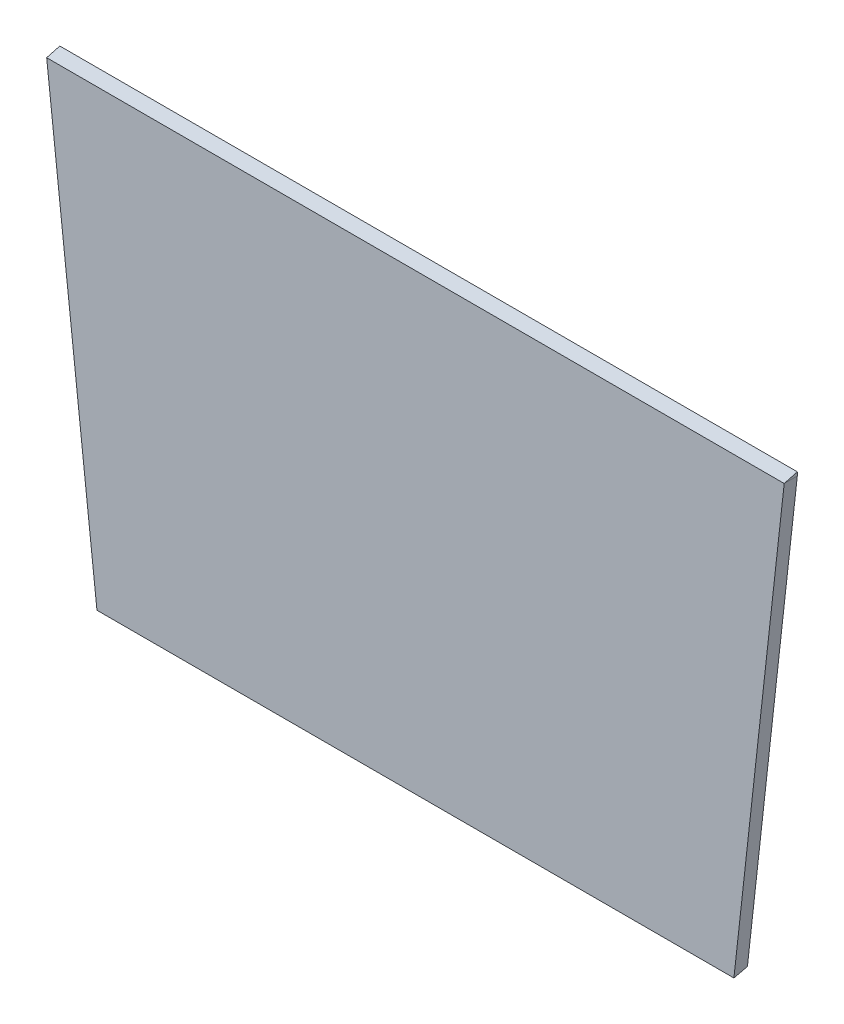
ISO-10303-21;
HEADER;
FILE_DESCRIPTION(('STEP AP214'),'2;1');
FILE_NAME('part.step','',(''),(''),'','','');
FILE_SCHEMA(('AUTOMOTIVE_DESIGN { 1 0 10303 214 1 1 1 1 }'));
ENDSEC;
DATA;
#1=APPLICATION_CONTEXT('core data for automotive mechanical design processes');
#2=APPLICATION_PROTOCOL_DEFINITION('international standard','automotive_design',2000,#1);
#3=PRODUCT_CONTEXT('',#1,'mechanical');
#4=PRODUCT('Part','Part','',(#3));
#5=PRODUCT_RELATED_PRODUCT_CATEGORY('part','',(#4));
#6=PRODUCT_DEFINITION_FORMATION('','',#4);
#7=PRODUCT_DEFINITION_CONTEXT('part definition',#1,'design');
#8=PRODUCT_DEFINITION('design','',#6,#7);
#9=PRODUCT_DEFINITION_SHAPE('','',#8);
#10=(LENGTH_UNIT() NAMED_UNIT(*) SI_UNIT(.MILLI.,.METRE.));
#11=(NAMED_UNIT(*) PLANE_ANGLE_UNIT() SI_UNIT($,.RADIAN.));
#12=(NAMED_UNIT(*) SI_UNIT($,.STERADIAN.) SOLID_ANGLE_UNIT());
#13=UNCERTAINTY_MEASURE_WITH_UNIT(LENGTH_MEASURE(1.E-05),#10,'distance_accuracy_value','');
#14=(GEOMETRIC_REPRESENTATION_CONTEXT(3) GLOBAL_UNCERTAINTY_ASSIGNED_CONTEXT((#13)) GLOBAL_UNIT_ASSIGNED_CONTEXT((#10,
#11,#12)) REPRESENTATION_CONTEXT('',''));
#15=CARTESIAN_POINT('',(0.,0.,0.));
#16=DIRECTION('',(0.,0.,1.));
#17=DIRECTION('',(1.,0.,0.));
#18=AXIS2_PLACEMENT_3D('',#15,#16,#17);
#19=CARTESIAN_POINT('',(-600.83870645417,-558.817416632332,30.));
#20=DIRECTION('',(0.993902559944356,0.110261966861001,0.));
#21=DIRECTION('',(-0.110261966861001,0.993902559944356,0.));
#22=AXIS2_PLACEMENT_3D('',#19,#20,#21);
#23=PLANE('',#22);
#24=DIRECTION('',(-0.0289999005365945,0.26140541659109,-0.964793352975499));
#25=VECTOR('',#24,1.);
#26=CARTESIAN_POINT('',(-600.83870645417,-558.817416632332,30.0000000000001));
#27=LINE('',#26,#25);
#28=CARTESIAN_POINT('',(-600.83870645417,-558.817416632332,30.));
#29=VERTEX_POINT('',#28);
#30=CARTESIAN_POINT('',(-601.740450867536,-550.689082752805,0.));
#31=VERTEX_POINT('',#30);
#32=EDGE_CURVE('E52',#29,#31,#27,.T.);
#33=ORIENTED_EDGE('',*,*,#32,.F.);
#34=DIRECTION('',(0.110261966861001,-0.993902559944356,0.));
#35=VECTOR('',#34,1.);
#36=CARTESIAN_POINT('',(-600.83870645417,-558.817416632332,30.));
#37=LINE('',#36,#35);
#38=CARTESIAN_POINT('',(-715.828706454171,477.703685082438,30.));
#39=VERTEX_POINT('',#38);
#40=EDGE_CURVE('E109',#39,#29,#37,.T.);
#41=ORIENTED_EDGE('',*,*,#40,.F.);
#42=DIRECTION('',(0.,0.,-1.));
#43=VECTOR('',#42,1.);
#44=CARTESIAN_POINT('',(-715.828706454171,477.703685082438,30.));
#45=LINE('',#44,#43);
#46=CARTESIAN_POINT('',(-715.828706454171,477.703685082438,0.));
#47=VERTEX_POINT('',#46);
#48=EDGE_CURVE('E72',#39,#47,#45,.T.);
#49=ORIENTED_EDGE('',*,*,#48,.T.);
#50=DIRECTION('',(0.110261966861001,-0.993902559944356,0.));
#51=VECTOR('',#50,1.);
#52=CARTESIAN_POINT('',(-600.83870645417,-558.817416632332,0.));
#53=LINE('',#52,#51);
#54=EDGE_CURVE('E112',#47,#31,#53,.T.);
#55=ORIENTED_EDGE('',*,*,#54,.T.);
#56=EDGE_LOOP('',(#33,#41,#49,#55));
#57=FACE_BOUND('',#56,.T.);
#58=ADVANCED_FACE('F39',(#57),#23,.F.);
#59=CARTESIAN_POINT('',(970.241293545829,477.703685082438,30.));
#60=DIRECTION('',(-0.993902559944356,0.110261966861,0.));
#61=DIRECTION('',(-0.110261966861,-0.993902559944356,0.));
#62=AXIS2_PLACEMENT_3D('',#59,#60,#61);
#63=PLANE('',#62);
#64=DIRECTION('',(-0.0289999005365941,-0.26140541659109,0.964793352975499));
#65=VECTOR('',#64,1.);
#66=CARTESIAN_POINT('',(863.205587204213,-487.117327701553,-234.630205870512));
#67=LINE('',#66,#65);
#68=CARTESIAN_POINT('',(856.153037959195,-550.689082752805,0.));
#69=VERTEX_POINT('',#68);
#70=CARTESIAN_POINT('',(855.25129354583,-558.817416632332,30.));
#71=VERTEX_POINT('',#70);
#72=EDGE_CURVE('E94',#69,#71,#67,.T.);
#73=ORIENTED_EDGE('',*,*,#72,.F.);
#74=DIRECTION('',(0.110261966861,0.993902559944356,0.));
#75=VECTOR('',#74,1.);
#76=CARTESIAN_POINT('',(970.241293545829,477.703685082438,0.));
#77=LINE('',#76,#75);
#78=CARTESIAN_POINT('',(970.2413,477.703685082439,0.));
#79=VERTEX_POINT('',#78);
#80=EDGE_CURVE('E105',#69,#79,#77,.T.);
#81=ORIENTED_EDGE('',*,*,#80,.T.);
#82=DIRECTION('',(0.,0.,-1.));
#83=VECTOR('',#82,1.);
#84=CARTESIAN_POINT('',(970.241293545829,477.703685082438,30.));
#85=LINE('',#84,#83);
#86=CARTESIAN_POINT('',(970.241293545829,477.703685082438,30.));
#87=VERTEX_POINT('',#86);
#88=EDGE_CURVE('E46',#87,#79,#85,.T.);
#89=ORIENTED_EDGE('',*,*,#88,.F.);
#90=DIRECTION('',(0.110261966861,0.993902559944356,0.));
#91=VECTOR('',#90,1.);
#92=CARTESIAN_POINT('',(970.241293545829,477.703685082438,30.));
#93=LINE('',#92,#91);
#94=EDGE_CURVE('E102',#71,#87,#93,.T.);
#95=ORIENTED_EDGE('',*,*,#94,.F.);
#96=EDGE_LOOP('',(#73,#81,#89,#95));
#97=FACE_BOUND('',#96,.T.);
#98=ADVANCED_FACE('F99',(#97),#63,.F.);
#99=CARTESIAN_POINT('',(0.,0.,0.));
#100=DIRECTION('',(0.,0.,-1.));
#101=DIRECTION('',(-1.,0.,0.));
#102=AXIS2_PLACEMENT_3D('',#99,#100,#101);
#103=PLANE('',#102);
#104=ORIENTED_EDGE('',*,*,#80,.F.);
#105=DIRECTION('',(-1.,0.,0.));
#106=VECTOR('',#105,1.);
#107=CARTESIAN_POINT('',(0.,-550.689082752805,0.));
#108=LINE('',#107,#106);
#109=EDGE_CURVE('E11',#69,#31,#108,.T.);
#110=ORIENTED_EDGE('',*,*,#109,.T.);
#111=ORIENTED_EDGE('',*,*,#54,.F.);
#112=DIRECTION('',(0.,1.,0.));
#113=VECTOR('',#112,1.);
#114=CARTESIAN_POINT('',(-715.8287,477.703685082439,0.));
#115=LINE('',#114,#113);
#116=CARTESIAN_POINT('',(-715.8287,485.832018961964,0.));
#117=VERTEX_POINT('',#116);
#118=EDGE_CURVE('E126',#47,#117,#115,.T.);
#119=ORIENTED_EDGE('',*,*,#118,.T.);
#120=DIRECTION('',(1.,0.,0.));
#121=VECTOR('',#120,1.);
#122=CARTESIAN_POINT('',(-715.8287,485.832018961964,0.));
#123=LINE('',#122,#121);
#124=CARTESIAN_POINT('',(970.2413,485.832018961964,0.));
#125=VERTEX_POINT('',#124);
#126=EDGE_CURVE('E78',#117,#125,#123,.T.);
#127=ORIENTED_EDGE('',*,*,#126,.T.);
#128=DIRECTION('',(0.,1.,0.));
#129=VECTOR('',#128,1.);
#130=CARTESIAN_POINT('',(970.2413,477.703685082439,0.));
#131=LINE('',#130,#129);
#132=EDGE_CURVE('E108',#79,#125,#131,.T.);
#133=ORIENTED_EDGE('',*,*,#132,.F.);
#134=EDGE_LOOP('',(#104,#110,#111,#119,#127,#133));
#135=FACE_BOUND('',#134,.T.);
#136=ADVANCED_FACE('F110',(#135),#103,.T.);
#137=CARTESIAN_POINT('',(0.,0.,30.));
#138=DIRECTION('',(0.,0.,-1.));
#139=DIRECTION('',(-1.,0.,0.));
#140=AXIS2_PLACEMENT_3D('',#137,#138,#139);
#141=PLANE('',#140);
#142=ORIENTED_EDGE('',*,*,#40,.T.);
#143=DIRECTION('',(1.,0.,0.));
#144=VECTOR('',#143,1.);
#145=CARTESIAN_POINT('',(855.25129354583,-558.817416632332,30.));
#146=LINE('',#145,#144);
#147=EDGE_CURVE('E114',#29,#71,#146,.T.);
#148=ORIENTED_EDGE('',*,*,#147,.T.);
#149=ORIENTED_EDGE('',*,*,#94,.T.);
#150=DIRECTION('',(-1.,0.,0.));
#151=VECTOR('',#150,1.);
#152=CARTESIAN_POINT('',(-715.828706454171,477.703685082438,30.));
#153=LINE('',#152,#151);
#154=EDGE_CURVE('E64',#87,#39,#153,.T.);
#155=ORIENTED_EDGE('',*,*,#154,.T.);
#156=EDGE_LOOP('',(#142,#148,#149,#155));
#157=FACE_BOUND('',#156,.T.);
#158=ADVANCED_FACE('F145',(#157),#141,.F.);
#159=CARTESIAN_POINT('',(-715.8287,485.832018961964,0.));
#160=DIRECTION('',(0.,0.965199301866008,0.261515406195068));
#161=DIRECTION('',(0.,-0.261515406195068,0.965199301866008));
#162=AXIS2_PLACEMENT_3D('',#159,#160,#161);
#163=PLANE('',#162);
#164=ORIENTED_EDGE('',*,*,#154,.F.);
#165=DIRECTION('',(0.,-0.261515406195068,0.965199301866008));
#166=VECTOR('',#165,1.);
#167=CARTESIAN_POINT('',(970.2413,485.832018961964,0.));
#168=LINE('',#167,#166);
#169=EDGE_CURVE('E122',#125,#87,#168,.T.);
#170=ORIENTED_EDGE('',*,*,#169,.F.);
#171=ORIENTED_EDGE('',*,*,#126,.F.);
#172=DIRECTION('',(0.,-0.261515406195068,0.965199301866008));
#173=VECTOR('',#172,1.);
#174=CARTESIAN_POINT('',(-715.8287,485.832018961964,0.));
#175=LINE('',#174,#173);
#176=EDGE_CURVE('E124',#117,#39,#175,.T.);
#177=ORIENTED_EDGE('',*,*,#176,.T.);
#178=EDGE_LOOP('',(#164,#170,#171,#177));
#179=FACE_BOUND('',#178,.T.);
#180=ADVANCED_FACE('F125',(#179),#163,.T.);
#181=CARTESIAN_POINT('',(-715.8287,0.,0.));
#182=DIRECTION('',(-1.,0.,0.));
#183=DIRECTION('',(0.,0.,1.));
#184=AXIS2_PLACEMENT_3D('',#181,#182,#183);
#185=PLANE('',#184);
#186=ORIENTED_EDGE('',*,*,#176,.F.);
#187=ORIENTED_EDGE('',*,*,#118,.F.);
#188=ORIENTED_EDGE('',*,*,#48,.F.);
#189=EDGE_LOOP('',(#186,#187,#188));
#190=FACE_BOUND('',#189,.T.);
#191=ADVANCED_FACE('F137',(#190),#185,.T.);
#192=CARTESIAN_POINT('',(970.2413,0.,0.));
#193=DIRECTION('',(-1.,0.,0.));
#194=DIRECTION('',(0.,0.,1.));
#195=AXIS2_PLACEMENT_3D('',#192,#193,#194);
#196=PLANE('',#195);
#197=ORIENTED_EDGE('',*,*,#169,.T.);
#198=ORIENTED_EDGE('',*,*,#88,.T.);
#199=ORIENTED_EDGE('',*,*,#132,.T.);
#200=EDGE_LOOP('',(#197,#198,#199));
#201=FACE_BOUND('',#200,.T.);
#202=ADVANCED_FACE('F117',(#201),#196,.F.);
#203=CARTESIAN_POINT('',(970.2413,-558.817416632332,30.));
#204=DIRECTION('',(0.,-0.965199301866001,-0.261515406195091));
#205=DIRECTION('',(0.,0.261515406195091,-0.965199301866001));
#206=AXIS2_PLACEMENT_3D('',#203,#204,#205);
#207=PLANE('',#206);
#208=ORIENTED_EDGE('',*,*,#32,.T.);
#209=ORIENTED_EDGE('',*,*,#109,.F.);
#210=ORIENTED_EDGE('',*,*,#72,.T.);
#211=ORIENTED_EDGE('',*,*,#147,.F.);
#212=EDGE_LOOP('',(#208,#209,#210,#211));
#213=FACE_BOUND('',#212,.T.);
#214=ADVANCED_FACE('F91',(#213),#207,.T.);
#215=CLOSED_SHELL('',(#58,#98,#136,#158,#180,#191,#202,#214));
#216=MANIFOLD_SOLID_BREP('B2',#215);
#217=ADVANCED_BREP_SHAPE_REPRESENTATION('',(#18,#216),#14);
#218=SHAPE_DEFINITION_REPRESENTATION(#9,#217);
ENDSEC;
END-ISO-10303-21;
